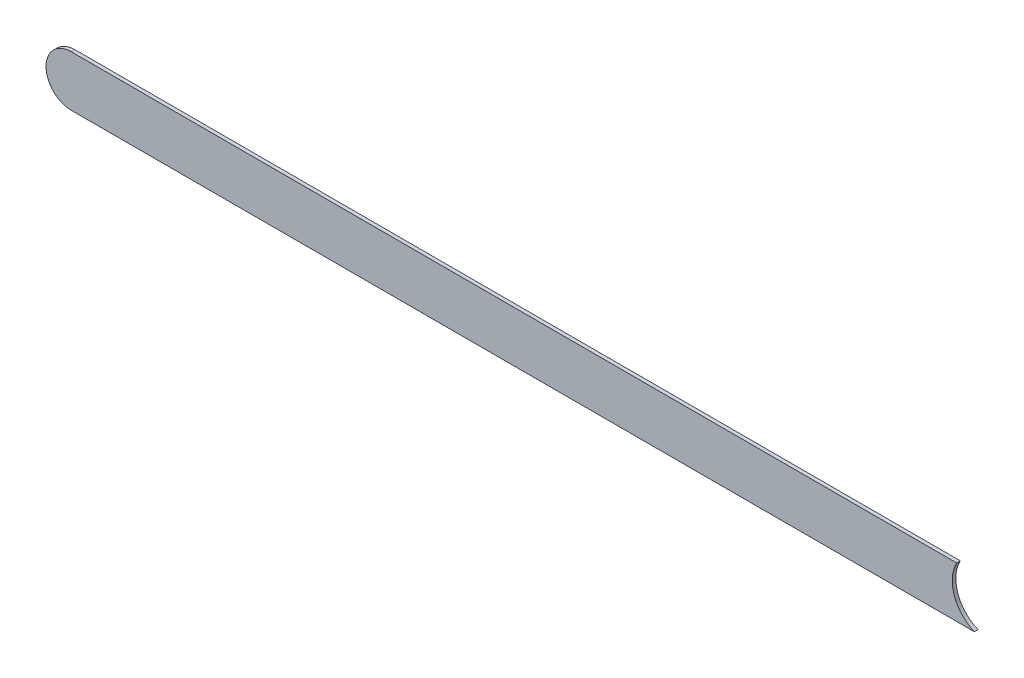
ISO-10303-21;
HEADER;
FILE_DESCRIPTION(('STEP AP214'),'2;1');
FILE_NAME('part.step','',(''),(''),'','','');
FILE_SCHEMA(('AUTOMOTIVE_DESIGN { 1 0 10303 214 1 1 1 1 }'));
ENDSEC;
DATA;
#1=APPLICATION_CONTEXT('core data for automotive mechanical design processes');
#2=APPLICATION_PROTOCOL_DEFINITION('international standard','automotive_design',2000,#1);
#3=PRODUCT_CONTEXT('',#1,'mechanical');
#4=PRODUCT('Part','Part','',(#3));
#5=PRODUCT_RELATED_PRODUCT_CATEGORY('part','',(#4));
#6=PRODUCT_DEFINITION_FORMATION('','',#4);
#7=PRODUCT_DEFINITION_CONTEXT('part definition',#1,'design');
#8=PRODUCT_DEFINITION('design','',#6,#7);
#9=PRODUCT_DEFINITION_SHAPE('','',#8);
#10=(LENGTH_UNIT() NAMED_UNIT(*) SI_UNIT(.MILLI.,.METRE.));
#11=(NAMED_UNIT(*) PLANE_ANGLE_UNIT() SI_UNIT($,.RADIAN.));
#12=(NAMED_UNIT(*) SI_UNIT($,.STERADIAN.) SOLID_ANGLE_UNIT());
#13=UNCERTAINTY_MEASURE_WITH_UNIT(LENGTH_MEASURE(1.E-05),#10,'distance_accuracy_value','');
#14=(GEOMETRIC_REPRESENTATION_CONTEXT(3) GLOBAL_UNCERTAINTY_ASSIGNED_CONTEXT((#13)) GLOBAL_UNIT_ASSIGNED_CONTEXT((#10,
#11,#12)) REPRESENTATION_CONTEXT('',''));
#15=CARTESIAN_POINT('',(0.,0.,0.));
#16=DIRECTION('',(0.,0.,1.));
#17=DIRECTION('',(1.,0.,0.));
#18=AXIS2_PLACEMENT_3D('',#15,#16,#17);
#19=CARTESIAN_POINT('',(49.36500414,95.17201184,0.));
#20=DIRECTION('',(0.,1.,0.));
#21=DIRECTION('',(1.,0.,0.));
#22=AXIS2_PLACEMENT_3D('',#19,#20,#21);
#23=PLANE('',#22);
#24=DIRECTION('',(1.,0.,0.));
#25=VECTOR('',#24,1.);
#26=CARTESIAN_POINT('',(49.36500414,95.17201184,0.03556));
#27=LINE('',#26,#25);
#28=CARTESIAN_POINT('',(49.36500414,95.17201184,0.03556));
#29=VERTEX_POINT('',#28);
#30=CARTESIAN_POINT('',(58.2626120678637,95.17201184,0.03556));
#31=VERTEX_POINT('',#30);
#32=EDGE_CURVE('E11',#29,#31,#27,.T.);
#33=ORIENTED_EDGE('',*,*,#32,.F.);
#34=DIRECTION('',(0.,0.,1.));
#35=VECTOR('',#34,1.);
#36=CARTESIAN_POINT('',(49.36500414,95.17201184,0.));
#37=LINE('',#36,#35);
#38=CARTESIAN_POINT('',(49.36500414,95.17201184,0.));
#39=VERTEX_POINT('',#38);
#40=EDGE_CURVE('E24',#39,#29,#37,.T.);
#41=ORIENTED_EDGE('',*,*,#40,.F.);
#42=DIRECTION('',(1.,0.,0.));
#43=VECTOR('',#42,1.);
#44=CARTESIAN_POINT('',(49.36500414,95.17201184,0.));
#45=LINE('',#44,#43);
#46=CARTESIAN_POINT('',(58.2626120678637,95.17201184,0.));
#47=VERTEX_POINT('',#46);
#48=EDGE_CURVE('E75',#39,#47,#45,.T.);
#49=ORIENTED_EDGE('',*,*,#48,.T.);
#50=DIRECTION('',(0.,0.,1.));
#51=VECTOR('',#50,1.);
#52=CARTESIAN_POINT('',(58.2626120678637,95.17201184,0.));
#53=LINE('',#52,#51);
#54=EDGE_CURVE('E37',#47,#31,#53,.T.);
#55=ORIENTED_EDGE('',*,*,#54,.T.);
#56=EDGE_LOOP('',(#33,#41,#49,#55));
#57=FACE_BOUND('',#56,.T.);
#58=ADVANCED_FACE('F17',(#57),#23,.F.);
#59=CARTESIAN_POINT('',(58.40000004,95.4999995,0.));
#60=DIRECTION('',(0.,0.,-1.));
#61=DIRECTION('',(1.,0.,0.));
#62=AXIS2_PLACEMENT_3D('',#59,#60,#61);
#63=CYLINDRICAL_SURFACE('',#62,0.3556);
#64=DIRECTION('',(0.,0.,1.));
#65=VECTOR('',#64,1.);
#66=CARTESIAN_POINT('',(58.0887710906534,95.67201084,0.));
#67=LINE('',#66,#65);
#68=CARTESIAN_POINT('',(58.0887710906534,95.67201084,0.));
#69=VERTEX_POINT('',#68);
#70=CARTESIAN_POINT('',(58.0887710906534,95.67201084,0.03556));
#71=VERTEX_POINT('',#70);
#72=EDGE_CURVE('E67',#69,#71,#67,.T.);
#73=ORIENTED_EDGE('',*,*,#72,.T.);
#74=CARTESIAN_POINT('',(58.40000004,95.4999995,0.03556));
#75=DIRECTION('',(0.,0.,1.));
#76=DIRECTION('',(1.,0.,0.));
#77=AXIS2_PLACEMENT_3D('',#74,#75,#76);
#78=CIRCLE('',#77,0.3556);
#79=EDGE_CURVE('E82',#71,#31,#78,.T.);
#80=ORIENTED_EDGE('',*,*,#79,.T.);
#81=ORIENTED_EDGE('',*,*,#54,.F.);
#82=CARTESIAN_POINT('',(58.40000004,95.4999995,0.));
#83=DIRECTION('',(0.,0.,1.));
#84=DIRECTION('',(1.,0.,0.));
#85=AXIS2_PLACEMENT_3D('',#82,#83,#84);
#86=CIRCLE('',#85,0.3556);
#87=EDGE_CURVE('E80',#69,#47,#86,.T.);
#88=ORIENTED_EDGE('',*,*,#87,.F.);
#89=EDGE_LOOP('',(#73,#80,#81,#88));
#90=FACE_BOUND('',#89,.T.);
#91=ADVANCED_FACE('F88',(#90),#63,.F.);
#92=CARTESIAN_POINT('',(58.0887710906534,95.67201084,0.));
#93=DIRECTION('',(0.,-1.,0.));
#94=DIRECTION('',(-1.,0.,0.));
#95=AXIS2_PLACEMENT_3D('',#92,#93,#94);
#96=PLANE('',#95);
#97=DIRECTION('',(-1.,0.,0.));
#98=VECTOR('',#97,1.);
#99=CARTESIAN_POINT('',(58.32201188,95.67201084,0.03556));
#100=LINE('',#99,#98);
#101=CARTESIAN_POINT('',(49.36500414,95.67201084,0.03556));
#102=VERTEX_POINT('',#101);
#103=EDGE_CURVE('E71',#71,#102,#100,.T.);
#104=ORIENTED_EDGE('',*,*,#103,.F.);
#105=ORIENTED_EDGE('',*,*,#72,.F.);
#106=DIRECTION('',(-1.,0.,0.));
#107=VECTOR('',#106,1.);
#108=CARTESIAN_POINT('',(58.32201188,95.67201084,0.));
#109=LINE('',#108,#107);
#110=CARTESIAN_POINT('',(49.36500414,95.67201084,0.));
#111=VERTEX_POINT('',#110);
#112=EDGE_CURVE('E63',#69,#111,#109,.T.);
#113=ORIENTED_EDGE('',*,*,#112,.T.);
#114=DIRECTION('',(0.,0.,1.));
#115=VECTOR('',#114,1.);
#116=CARTESIAN_POINT('',(49.36500414,95.67201084,0.));
#117=LINE('',#116,#115);
#118=EDGE_CURVE('E53',#111,#102,#117,.T.);
#119=ORIENTED_EDGE('',*,*,#118,.T.);
#120=EDGE_LOOP('',(#104,#105,#113,#119));
#121=FACE_BOUND('',#120,.T.);
#122=ADVANCED_FACE('F66',(#121),#96,.F.);
#123=CARTESIAN_POINT('',(49.36500414,95.42201134,0.));
#124=DIRECTION('',(0.,0.,-1.));
#125=DIRECTION('',(0.,1.,0.));
#126=AXIS2_PLACEMENT_3D('',#123,#124,#125);
#127=CYLINDRICAL_SURFACE('',#126,0.249999499999992);
#128=CARTESIAN_POINT('',(49.36500414,95.42201134,0.03556));
#129=DIRECTION('',(0.,0.,1.));
#130=DIRECTION('',(0.,1.,0.));
#131=AXIS2_PLACEMENT_3D('',#128,#129,#130);
#132=CIRCLE('',#131,0.249999499999992);
#133=EDGE_CURVE('E59',#102,#29,#132,.T.);
#134=ORIENTED_EDGE('',*,*,#133,.F.);
#135=ORIENTED_EDGE('',*,*,#118,.F.);
#136=CARTESIAN_POINT('',(49.36500414,95.42201134,0.));
#137=DIRECTION('',(0.,0.,1.));
#138=DIRECTION('',(0.,1.,0.));
#139=AXIS2_PLACEMENT_3D('',#136,#137,#138);
#140=CIRCLE('',#139,0.249999499999992);
#141=EDGE_CURVE('E57',#111,#39,#140,.T.);
#142=ORIENTED_EDGE('',*,*,#141,.T.);
#143=ORIENTED_EDGE('',*,*,#40,.T.);
#144=EDGE_LOOP('',(#134,#135,#142,#143));
#145=FACE_BOUND('',#144,.T.);
#146=ADVANCED_FACE('F55',(#145),#127,.T.);
#147=CARTESIAN_POINT('',(49.36500414,95.17201184,0.));
#148=DIRECTION('',(0.,0.,-1.));
#149=DIRECTION('',(-1.,0.,0.));
#150=AXIS2_PLACEMENT_3D('',#147,#148,#149);
#151=PLANE('',#150);
#152=ORIENTED_EDGE('',*,*,#48,.F.);
#153=ORIENTED_EDGE('',*,*,#141,.F.);
#154=ORIENTED_EDGE('',*,*,#112,.F.);
#155=ORIENTED_EDGE('',*,*,#87,.T.);
#156=EDGE_LOOP('',(#152,#153,#154,#155));
#157=FACE_BOUND('',#156,.T.);
#158=ADVANCED_FACE('F74',(#157),#151,.T.);
#159=CARTESIAN_POINT('',(49.36500414,95.17201184,0.03556));
#160=DIRECTION('',(0.,0.,-1.));
#161=DIRECTION('',(-1.,0.,0.));
#162=AXIS2_PLACEMENT_3D('',#159,#160,#161);
#163=PLANE('',#162);
#164=ORIENTED_EDGE('',*,*,#133,.T.);
#165=ORIENTED_EDGE('',*,*,#32,.T.);
#166=ORIENTED_EDGE('',*,*,#79,.F.);
#167=ORIENTED_EDGE('',*,*,#103,.T.);
#168=EDGE_LOOP('',(#164,#165,#166,#167));
#169=FACE_BOUND('',#168,.T.);
#170=ADVANCED_FACE('F91',(#169),#163,.F.);
#171=CLOSED_SHELL('',(#58,#91,#122,#146,#158,#170));
#172=MANIFOLD_SOLID_BREP('B1',#171);
#173=ADVANCED_BREP_SHAPE_REPRESENTATION('',(#18,#172),#14);
#174=SHAPE_DEFINITION_REPRESENTATION(#9,#173);
ENDSEC;
END-ISO-10303-21;
